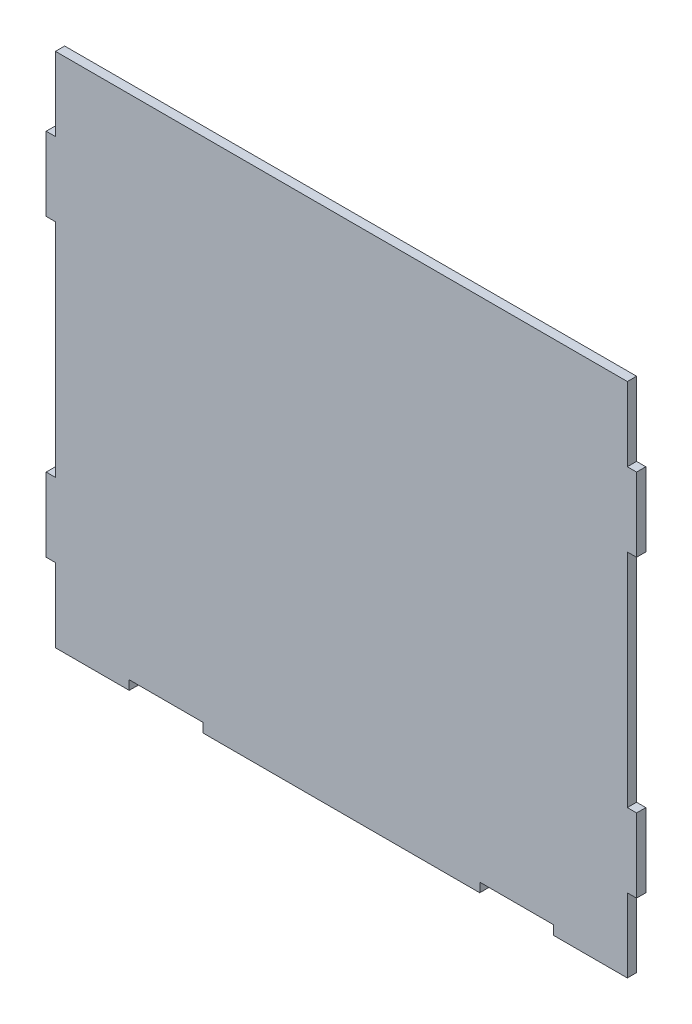
ISO-10303-21;
HEADER;
FILE_DESCRIPTION(('STEP AP214'),'2;1');
FILE_NAME('part.step','',(''),(''),'','','');
FILE_SCHEMA(('AUTOMOTIVE_DESIGN { 1 0 10303 214 1 1 1 1 }'));
ENDSEC;
DATA;
#1=APPLICATION_CONTEXT('core data for automotive mechanical design processes');
#2=APPLICATION_PROTOCOL_DEFINITION('international standard','automotive_design',2000,#1);
#3=PRODUCT_CONTEXT('',#1,'mechanical');
#4=PRODUCT('Part','Part','',(#3));
#5=PRODUCT_RELATED_PRODUCT_CATEGORY('part','',(#4));
#6=PRODUCT_DEFINITION_FORMATION('','',#4);
#7=PRODUCT_DEFINITION_CONTEXT('part definition',#1,'design');
#8=PRODUCT_DEFINITION('design','',#6,#7);
#9=PRODUCT_DEFINITION_SHAPE('','',#8);
#10=(LENGTH_UNIT() NAMED_UNIT(*) SI_UNIT(.MILLI.,.METRE.));
#11=(NAMED_UNIT(*) PLANE_ANGLE_UNIT() SI_UNIT($,.RADIAN.));
#12=(NAMED_UNIT(*) SI_UNIT($,.STERADIAN.) SOLID_ANGLE_UNIT());
#13=UNCERTAINTY_MEASURE_WITH_UNIT(LENGTH_MEASURE(1.E-05),#10,'distance_accuracy_value','');
#14=(GEOMETRIC_REPRESENTATION_CONTEXT(3) GLOBAL_UNCERTAINTY_ASSIGNED_CONTEXT((#13)) GLOBAL_UNIT_ASSIGNED_CONTEXT((#10,
#11,#12)) REPRESENTATION_CONTEXT('',''));
#15=CARTESIAN_POINT('',(0.,0.,0.));
#16=DIRECTION('',(0.,0.,1.));
#17=DIRECTION('',(1.,0.,0.));
#18=AXIS2_PLACEMENT_3D('',#15,#16,#17);
#19=CARTESIAN_POINT('',(0.,25.4,3.175));
#20=DIRECTION('',(1.,0.,0.));
#21=DIRECTION('',(0.,0.,-1.));
#22=AXIS2_PLACEMENT_3D('',#19,#20,#21);
#23=PLANE('',#22);
#24=DIRECTION('',(0.,-1.,0.));
#25=VECTOR('',#24,1.);
#26=CARTESIAN_POINT('',(0.,25.4,0.));
#27=LINE('',#26,#25);
#28=CARTESIAN_POINT('',(0.,25.4,0.));
#29=VERTEX_POINT('',#28);
#30=CARTESIAN_POINT('',(0.,0.,0.));
#31=VERTEX_POINT('',#30);
#32=EDGE_CURVE('E249',#29,#31,#27,.T.);
#33=ORIENTED_EDGE('',*,*,#32,.T.);
#34=DIRECTION('',(0.,0.,-1.));
#35=VECTOR('',#34,1.);
#36=CARTESIAN_POINT('',(0.,0.,3.175));
#37=LINE('',#36,#35);
#38=CARTESIAN_POINT('',(0.,0.,3.175));
#39=VERTEX_POINT('',#38);
#40=EDGE_CURVE('E11',#39,#31,#37,.T.);
#41=ORIENTED_EDGE('',*,*,#40,.F.);
#42=DIRECTION('',(0.,-1.,0.));
#43=VECTOR('',#42,1.);
#44=CARTESIAN_POINT('',(0.,25.4,3.175));
#45=LINE('',#44,#43);
#46=CARTESIAN_POINT('',(0.,25.4,3.175));
#47=VERTEX_POINT('',#46);
#48=EDGE_CURVE('E303',#47,#39,#45,.T.);
#49=ORIENTED_EDGE('',*,*,#48,.F.);
#50=DIRECTION('',(0.,0.,-1.));
#51=VECTOR('',#50,1.);
#52=CARTESIAN_POINT('',(0.,25.4,3.175));
#53=LINE('',#52,#51);
#54=EDGE_CURVE('E245',#47,#29,#53,.T.);
#55=ORIENTED_EDGE('',*,*,#54,.T.);
#56=EDGE_LOOP('',(#33,#41,#49,#55));
#57=FACE_BOUND('',#56,.T.);
#58=ADVANCED_FACE('F33',(#57),#23,.F.);
#59=CARTESIAN_POINT('',(0.,0.,3.175));
#60=DIRECTION('',(0.,1.,0.));
#61=DIRECTION('',(0.,0.,1.));
#62=AXIS2_PLACEMENT_3D('',#59,#60,#61);
#63=PLANE('',#62);
#64=DIRECTION('',(1.,0.,0.));
#65=VECTOR('',#64,1.);
#66=CARTESIAN_POINT('',(0.,0.,0.));
#67=LINE('',#66,#65);
#68=CARTESIAN_POINT('',(25.4,0.,0.));
#69=VERTEX_POINT('',#68);
#70=EDGE_CURVE('E252',#31,#69,#67,.T.);
#71=ORIENTED_EDGE('',*,*,#70,.T.);
#72=DIRECTION('',(0.,0.,-1.));
#73=VECTOR('',#72,1.);
#74=CARTESIAN_POINT('',(25.4,0.,3.175));
#75=LINE('',#74,#73);
#76=CARTESIAN_POINT('',(25.4,0.,3.175));
#77=VERTEX_POINT('',#76);
#78=EDGE_CURVE('E41',#77,#69,#75,.T.);
#79=ORIENTED_EDGE('',*,*,#78,.F.);
#80=DIRECTION('',(1.,0.,0.));
#81=VECTOR('',#80,1.);
#82=CARTESIAN_POINT('',(0.,0.,3.175));
#83=LINE('',#82,#81);
#84=EDGE_CURVE('E152',#39,#77,#83,.T.);
#85=ORIENTED_EDGE('',*,*,#84,.F.);
#86=ORIENTED_EDGE('',*,*,#40,.T.);
#87=EDGE_LOOP('',(#71,#79,#85,#86));
#88=FACE_BOUND('',#87,.T.);
#89=ADVANCED_FACE('F461',(#88),#63,.F.);
#90=CARTESIAN_POINT('',(25.4,0.,3.175));
#91=DIRECTION('',(-1.,0.,0.));
#92=DIRECTION('',(0.,0.,1.));
#93=AXIS2_PLACEMENT_3D('',#90,#91,#92);
#94=PLANE('',#93);
#95=DIRECTION('',(0.,1.,0.));
#96=VECTOR('',#95,1.);
#97=CARTESIAN_POINT('',(25.4,0.,0.));
#98=LINE('',#97,#96);
#99=CARTESIAN_POINT('',(25.4,3.17500000000001,0.));
#100=VERTEX_POINT('',#99);
#101=EDGE_CURVE('E254',#69,#100,#98,.T.);
#102=ORIENTED_EDGE('',*,*,#101,.T.);
#103=DIRECTION('',(0.,0.,-1.));
#104=VECTOR('',#103,1.);
#105=CARTESIAN_POINT('',(25.4,3.17500000000001,3.175));
#106=LINE('',#105,#104);
#107=CARTESIAN_POINT('',(25.4,3.17500000000001,3.175));
#108=VERTEX_POINT('',#107);
#109=EDGE_CURVE('E370',#108,#100,#106,.T.);
#110=ORIENTED_EDGE('',*,*,#109,.F.);
#111=DIRECTION('',(0.,1.,0.));
#112=VECTOR('',#111,1.);
#113=CARTESIAN_POINT('',(25.4,0.,3.175));
#114=LINE('',#113,#112);
#115=EDGE_CURVE('E378',#77,#108,#114,.T.);
#116=ORIENTED_EDGE('',*,*,#115,.F.);
#117=ORIENTED_EDGE('',*,*,#78,.T.);
#118=EDGE_LOOP('',(#102,#110,#116,#117));
#119=FACE_BOUND('',#118,.T.);
#120=ADVANCED_FACE('F376',(#119),#94,.F.);
#121=CARTESIAN_POINT('',(25.4,3.17500000000001,3.175));
#122=DIRECTION('',(0.,1.,0.));
#123=DIRECTION('',(0.,0.,1.));
#124=AXIS2_PLACEMENT_3D('',#121,#122,#123);
#125=PLANE('',#124);
#126=DIRECTION('',(1.,0.,0.));
#127=VECTOR('',#126,1.);
#128=CARTESIAN_POINT('',(25.4,3.17500000000001,0.));
#129=LINE('',#128,#127);
#130=CARTESIAN_POINT('',(50.8,3.17500000000001,0.));
#131=VERTEX_POINT('',#130);
#132=EDGE_CURVE('E256',#100,#131,#129,.T.);
#133=ORIENTED_EDGE('',*,*,#132,.T.);
#134=DIRECTION('',(0.,0.,-1.));
#135=VECTOR('',#134,1.);
#136=CARTESIAN_POINT('',(50.8,3.17500000000001,3.175));
#137=LINE('',#136,#135);
#138=CARTESIAN_POINT('',(50.8,3.17500000000001,3.175));
#139=VERTEX_POINT('',#138);
#140=EDGE_CURVE('E367',#139,#131,#137,.T.);
#141=ORIENTED_EDGE('',*,*,#140,.F.);
#142=DIRECTION('',(1.,0.,0.));
#143=VECTOR('',#142,1.);
#144=CARTESIAN_POINT('',(25.4,3.17500000000001,3.175));
#145=LINE('',#144,#143);
#146=EDGE_CURVE('E396',#108,#139,#145,.T.);
#147=ORIENTED_EDGE('',*,*,#146,.F.);
#148=ORIENTED_EDGE('',*,*,#109,.T.);
#149=EDGE_LOOP('',(#133,#141,#147,#148));
#150=FACE_BOUND('',#149,.T.);
#151=ADVANCED_FACE('F387',(#150),#125,.F.);
#152=CARTESIAN_POINT('',(50.8,3.17500000000001,3.175));
#153=DIRECTION('',(1.,0.,0.));
#154=DIRECTION('',(0.,0.,-1.));
#155=AXIS2_PLACEMENT_3D('',#152,#153,#154);
#156=PLANE('',#155);
#157=DIRECTION('',(0.,-1.,0.));
#158=VECTOR('',#157,1.);
#159=CARTESIAN_POINT('',(50.8,3.17500000000001,0.));
#160=LINE('',#159,#158);
#161=CARTESIAN_POINT('',(50.8,0.,0.));
#162=VERTEX_POINT('',#161);
#163=EDGE_CURVE('E258',#131,#162,#160,.T.);
#164=ORIENTED_EDGE('',*,*,#163,.T.);
#165=DIRECTION('',(0.,0.,-1.));
#166=VECTOR('',#165,1.);
#167=CARTESIAN_POINT('',(50.8,0.,3.175));
#168=LINE('',#167,#166);
#169=CARTESIAN_POINT('',(50.8,0.,3.175));
#170=VERTEX_POINT('',#169);
#171=EDGE_CURVE('E364',#170,#162,#168,.T.);
#172=ORIENTED_EDGE('',*,*,#171,.F.);
#173=DIRECTION('',(0.,-1.,0.));
#174=VECTOR('',#173,1.);
#175=CARTESIAN_POINT('',(50.8,3.17500000000001,3.175));
#176=LINE('',#175,#174);
#177=EDGE_CURVE('E393',#139,#170,#176,.T.);
#178=ORIENTED_EDGE('',*,*,#177,.F.);
#179=ORIENTED_EDGE('',*,*,#140,.T.);
#180=EDGE_LOOP('',(#164,#172,#178,#179));
#181=FACE_BOUND('',#180,.T.);
#182=ADVANCED_FACE('F391',(#181),#156,.F.);
#183=CARTESIAN_POINT('',(50.8,0.,3.175));
#184=DIRECTION('',(0.,1.,0.));
#185=DIRECTION('',(0.,0.,1.));
#186=AXIS2_PLACEMENT_3D('',#183,#184,#185);
#187=PLANE('',#186);
#188=DIRECTION('',(1.,0.,0.));
#189=VECTOR('',#188,1.);
#190=CARTESIAN_POINT('',(50.8,0.,0.));
#191=LINE('',#190,#189);
#192=CARTESIAN_POINT('',(146.05,0.,0.));
#193=VERTEX_POINT('',#192);
#194=EDGE_CURVE('E260',#162,#193,#191,.T.);
#195=ORIENTED_EDGE('',*,*,#194,.T.);
#196=DIRECTION('',(0.,0.,-1.));
#197=VECTOR('',#196,1.);
#198=CARTESIAN_POINT('',(146.05,0.,3.175));
#199=LINE('',#198,#197);
#200=CARTESIAN_POINT('',(146.05,0.,3.175));
#201=VERTEX_POINT('',#200);
#202=EDGE_CURVE('E361',#201,#193,#199,.T.);
#203=ORIENTED_EDGE('',*,*,#202,.F.);
#204=DIRECTION('',(1.,0.,0.));
#205=VECTOR('',#204,1.);
#206=CARTESIAN_POINT('',(50.8,0.,3.175));
#207=LINE('',#206,#205);
#208=EDGE_CURVE('E395',#170,#201,#207,.T.);
#209=ORIENTED_EDGE('',*,*,#208,.F.);
#210=ORIENTED_EDGE('',*,*,#171,.T.);
#211=EDGE_LOOP('',(#195,#203,#209,#210));
#212=FACE_BOUND('',#211,.T.);
#213=ADVANCED_FACE('F474',(#212),#187,.F.);
#214=CARTESIAN_POINT('',(146.05,0.,3.175));
#215=DIRECTION('',(-1.,0.,0.));
#216=DIRECTION('',(0.,0.,1.));
#217=AXIS2_PLACEMENT_3D('',#214,#215,#216);
#218=PLANE('',#217);
#219=DIRECTION('',(0.,1.,0.));
#220=VECTOR('',#219,1.);
#221=CARTESIAN_POINT('',(146.05,0.,0.));
#222=LINE('',#221,#220);
#223=CARTESIAN_POINT('',(146.05,3.17500000000001,0.));
#224=VERTEX_POINT('',#223);
#225=EDGE_CURVE('E262',#193,#224,#222,.T.);
#226=ORIENTED_EDGE('',*,*,#225,.T.);
#227=DIRECTION('',(0.,0.,-1.));
#228=VECTOR('',#227,1.);
#229=CARTESIAN_POINT('',(146.05,3.17500000000001,3.175));
#230=LINE('',#229,#228);
#231=CARTESIAN_POINT('',(146.05,3.17500000000001,3.175));
#232=VERTEX_POINT('',#231);
#233=EDGE_CURVE('E358',#232,#224,#230,.T.);
#234=ORIENTED_EDGE('',*,*,#233,.F.);
#235=DIRECTION('',(0.,1.,0.));
#236=VECTOR('',#235,1.);
#237=CARTESIAN_POINT('',(146.05,0.,3.175));
#238=LINE('',#237,#236);
#239=EDGE_CURVE('E398',#201,#232,#238,.T.);
#240=ORIENTED_EDGE('',*,*,#239,.F.);
#241=ORIENTED_EDGE('',*,*,#202,.T.);
#242=EDGE_LOOP('',(#226,#234,#240,#241));
#243=FACE_BOUND('',#242,.T.);
#244=ADVANCED_FACE('F477',(#243),#218,.F.);
#245=CARTESIAN_POINT('',(146.05,3.17500000000001,3.175));
#246=DIRECTION('',(0.,1.,0.));
#247=DIRECTION('',(0.,0.,1.));
#248=AXIS2_PLACEMENT_3D('',#245,#246,#247);
#249=PLANE('',#248);
#250=DIRECTION('',(1.,0.,0.));
#251=VECTOR('',#250,1.);
#252=CARTESIAN_POINT('',(146.05,3.17500000000001,0.));
#253=LINE('',#252,#251);
#254=CARTESIAN_POINT('',(171.45,3.17500000000001,0.));
#255=VERTEX_POINT('',#254);
#256=EDGE_CURVE('E264',#224,#255,#253,.T.);
#257=ORIENTED_EDGE('',*,*,#256,.T.);
#258=DIRECTION('',(0.,0.,-1.));
#259=VECTOR('',#258,1.);
#260=CARTESIAN_POINT('',(171.45,3.17500000000001,3.175));
#261=LINE('',#260,#259);
#262=CARTESIAN_POINT('',(171.45,3.17500000000001,3.175));
#263=VERTEX_POINT('',#262);
#264=EDGE_CURVE('E355',#263,#255,#261,.T.);
#265=ORIENTED_EDGE('',*,*,#264,.F.);
#266=DIRECTION('',(1.,0.,0.));
#267=VECTOR('',#266,1.);
#268=CARTESIAN_POINT('',(146.05,3.17500000000001,3.175));
#269=LINE('',#268,#267);
#270=EDGE_CURVE('E404',#232,#263,#269,.T.);
#271=ORIENTED_EDGE('',*,*,#270,.F.);
#272=ORIENTED_EDGE('',*,*,#233,.T.);
#273=EDGE_LOOP('',(#257,#265,#271,#272));
#274=FACE_BOUND('',#273,.T.);
#275=ADVANCED_FACE('F481',(#274),#249,.F.);
#276=CARTESIAN_POINT('',(171.45,3.17500000000001,3.175));
#277=DIRECTION('',(1.,0.,0.));
#278=DIRECTION('',(0.,1.,0.));
#279=AXIS2_PLACEMENT_3D('',#276,#277,#278);
#280=PLANE('',#279);
#281=DIRECTION('',(0.,-1.,0.));
#282=VECTOR('',#281,1.);
#283=CARTESIAN_POINT('',(171.45,3.17500000000001,0.));
#284=LINE('',#283,#282);
#285=CARTESIAN_POINT('',(171.45,0.,0.));
#286=VERTEX_POINT('',#285);
#287=EDGE_CURVE('E266',#255,#286,#284,.T.);
#288=ORIENTED_EDGE('',*,*,#287,.T.);
#289=DIRECTION('',(0.,0.,-1.));
#290=VECTOR('',#289,1.);
#291=CARTESIAN_POINT('',(171.45,0.,3.175));
#292=LINE('',#291,#290);
#293=CARTESIAN_POINT('',(171.45,0.,3.175));
#294=VERTEX_POINT('',#293);
#295=EDGE_CURVE('E352',#294,#286,#292,.T.);
#296=ORIENTED_EDGE('',*,*,#295,.F.);
#297=DIRECTION('',(0.,-1.,0.));
#298=VECTOR('',#297,1.);
#299=CARTESIAN_POINT('',(171.45,3.17500000000001,3.175));
#300=LINE('',#299,#298);
#301=EDGE_CURVE('E406',#263,#294,#300,.T.);
#302=ORIENTED_EDGE('',*,*,#301,.F.);
#303=ORIENTED_EDGE('',*,*,#264,.T.);
#304=EDGE_LOOP('',(#288,#296,#302,#303));
#305=FACE_BOUND('',#304,.T.);
#306=ADVANCED_FACE('F485',(#305),#280,.F.);
#307=CARTESIAN_POINT('',(171.45,0.,3.175));
#308=DIRECTION('',(0.,1.,0.));
#309=DIRECTION('',(0.,0.,1.));
#310=AXIS2_PLACEMENT_3D('',#307,#308,#309);
#311=PLANE('',#310);
#312=DIRECTION('',(1.,0.,0.));
#313=VECTOR('',#312,1.);
#314=CARTESIAN_POINT('',(171.45,0.,0.));
#315=LINE('',#314,#313);
#316=CARTESIAN_POINT('',(196.85,0.,0.));
#317=VERTEX_POINT('',#316);
#318=EDGE_CURVE('E268',#286,#317,#315,.T.);
#319=ORIENTED_EDGE('',*,*,#318,.T.);
#320=DIRECTION('',(0.,0.,-1.));
#321=VECTOR('',#320,1.);
#322=CARTESIAN_POINT('',(196.85,0.,3.175));
#323=LINE('',#322,#321);
#324=CARTESIAN_POINT('',(196.85,0.,3.175));
#325=VERTEX_POINT('',#324);
#326=EDGE_CURVE('E349',#325,#317,#323,.T.);
#327=ORIENTED_EDGE('',*,*,#326,.F.);
#328=DIRECTION('',(1.,0.,0.));
#329=VECTOR('',#328,1.);
#330=CARTESIAN_POINT('',(171.45,0.,3.175));
#331=LINE('',#330,#329);
#332=EDGE_CURVE('E408',#294,#325,#331,.T.);
#333=ORIENTED_EDGE('',*,*,#332,.F.);
#334=ORIENTED_EDGE('',*,*,#295,.T.);
#335=EDGE_LOOP('',(#319,#327,#333,#334));
#336=FACE_BOUND('',#335,.T.);
#337=ADVANCED_FACE('F489',(#336),#311,.F.);
#338=CARTESIAN_POINT('',(196.85,25.4,3.175));
#339=DIRECTION('',(-1.,0.,0.));
#340=DIRECTION('',(0.,-1.,0.));
#341=AXIS2_PLACEMENT_3D('',#338,#339,#340);
#342=PLANE('',#341);
#343=DIRECTION('',(0.,1.,0.));
#344=VECTOR('',#343,1.);
#345=CARTESIAN_POINT('',(196.85,25.4,0.));
#346=LINE('',#345,#344);
#347=CARTESIAN_POINT('',(196.85,25.4,0.));
#348=VERTEX_POINT('',#347);
#349=EDGE_CURVE('E270',#317,#348,#346,.T.);
#350=ORIENTED_EDGE('',*,*,#349,.T.);
#351=DIRECTION('',(0.,0.,-1.));
#352=VECTOR('',#351,1.);
#353=CARTESIAN_POINT('',(196.85,25.4,3.175));
#354=LINE('',#353,#352);
#355=CARTESIAN_POINT('',(196.85,25.4,3.175));
#356=VERTEX_POINT('',#355);
#357=EDGE_CURVE('E346',#356,#348,#354,.T.);
#358=ORIENTED_EDGE('',*,*,#357,.F.);
#359=DIRECTION('',(0.,1.,0.));
#360=VECTOR('',#359,1.);
#361=CARTESIAN_POINT('',(196.85,25.4,3.175));
#362=LINE('',#361,#360);
#363=EDGE_CURVE('E410',#325,#356,#362,.T.);
#364=ORIENTED_EDGE('',*,*,#363,.F.);
#365=ORIENTED_EDGE('',*,*,#326,.T.);
#366=EDGE_LOOP('',(#350,#358,#364,#365));
#367=FACE_BOUND('',#366,.T.);
#368=ADVANCED_FACE('F493',(#367),#342,.F.);
#369=CARTESIAN_POINT('',(200.025,25.4,3.175));
#370=DIRECTION('',(0.,1.,0.));
#371=DIRECTION('',(-1.,0.,0.));
#372=AXIS2_PLACEMENT_3D('',#369,#370,#371);
#373=PLANE('',#372);
#374=DIRECTION('',(1.,0.,0.));
#375=VECTOR('',#374,1.);
#376=CARTESIAN_POINT('',(200.025,25.4,0.));
#377=LINE('',#376,#375);
#378=CARTESIAN_POINT('',(200.025,25.4,0.));
#379=VERTEX_POINT('',#378);
#380=EDGE_CURVE('E272',#348,#379,#377,.T.);
#381=ORIENTED_EDGE('',*,*,#380,.T.);
#382=DIRECTION('',(0.,0.,-1.));
#383=VECTOR('',#382,1.);
#384=CARTESIAN_POINT('',(200.025,25.4,3.175));
#385=LINE('',#384,#383);
#386=CARTESIAN_POINT('',(200.025,25.4,3.175));
#387=VERTEX_POINT('',#386);
#388=EDGE_CURVE('E343',#387,#379,#385,.T.);
#389=ORIENTED_EDGE('',*,*,#388,.F.);
#390=DIRECTION('',(1.,0.,0.));
#391=VECTOR('',#390,1.);
#392=CARTESIAN_POINT('',(200.025,25.4,3.175));
#393=LINE('',#392,#391);
#394=EDGE_CURVE('E412',#356,#387,#393,.T.);
#395=ORIENTED_EDGE('',*,*,#394,.F.);
#396=ORIENTED_EDGE('',*,*,#357,.T.);
#397=EDGE_LOOP('',(#381,#389,#395,#396));
#398=FACE_BOUND('',#397,.T.);
#399=ADVANCED_FACE('F497',(#398),#373,.F.);
#400=CARTESIAN_POINT('',(200.025,50.8,3.175));
#401=DIRECTION('',(-1.,0.,0.));
#402=DIRECTION('',(0.,0.,1.));
#403=AXIS2_PLACEMENT_3D('',#400,#401,#402);
#404=PLANE('',#403);
#405=DIRECTION('',(0.,1.,0.));
#406=VECTOR('',#405,1.);
#407=CARTESIAN_POINT('',(200.025,50.8,0.));
#408=LINE('',#407,#406);
#409=CARTESIAN_POINT('',(200.025,50.8,0.));
#410=VERTEX_POINT('',#409);
#411=EDGE_CURVE('E274',#379,#410,#408,.T.);
#412=ORIENTED_EDGE('',*,*,#411,.T.);
#413=DIRECTION('',(0.,0.,-1.));
#414=VECTOR('',#413,1.);
#415=CARTESIAN_POINT('',(200.025,50.8,3.175));
#416=LINE('',#415,#414);
#417=CARTESIAN_POINT('',(200.025,50.8,3.175));
#418=VERTEX_POINT('',#417);
#419=EDGE_CURVE('E340',#418,#410,#416,.T.);
#420=ORIENTED_EDGE('',*,*,#419,.F.);
#421=DIRECTION('',(0.,1.,0.));
#422=VECTOR('',#421,1.);
#423=CARTESIAN_POINT('',(200.025,50.8,3.175));
#424=LINE('',#423,#422);
#425=EDGE_CURVE('E414',#387,#418,#424,.T.);
#426=ORIENTED_EDGE('',*,*,#425,.F.);
#427=ORIENTED_EDGE('',*,*,#388,.T.);
#428=EDGE_LOOP('',(#412,#420,#426,#427));
#429=FACE_BOUND('',#428,.T.);
#430=ADVANCED_FACE('F501',(#429),#404,.F.);
#431=CARTESIAN_POINT('',(196.85,50.8,3.175));
#432=DIRECTION('',(0.,-1.,0.));
#433=DIRECTION('',(1.,0.,0.));
#434=AXIS2_PLACEMENT_3D('',#431,#432,#433);
#435=PLANE('',#434);
#436=DIRECTION('',(-1.,0.,0.));
#437=VECTOR('',#436,1.);
#438=CARTESIAN_POINT('',(196.85,50.8,0.));
#439=LINE('',#438,#437);
#440=CARTESIAN_POINT('',(196.85,50.8,0.));
#441=VERTEX_POINT('',#440);
#442=EDGE_CURVE('E276',#410,#441,#439,.T.);
#443=ORIENTED_EDGE('',*,*,#442,.T.);
#444=DIRECTION('',(0.,0.,-1.));
#445=VECTOR('',#444,1.);
#446=CARTESIAN_POINT('',(196.85,50.8,3.175));
#447=LINE('',#446,#445);
#448=CARTESIAN_POINT('',(196.85,50.8,3.175));
#449=VERTEX_POINT('',#448);
#450=EDGE_CURVE('E337',#449,#441,#447,.T.);
#451=ORIENTED_EDGE('',*,*,#450,.F.);
#452=DIRECTION('',(-1.,0.,0.));
#453=VECTOR('',#452,1.);
#454=CARTESIAN_POINT('',(196.85,50.8,3.175));
#455=LINE('',#454,#453);
#456=EDGE_CURVE('E416',#418,#449,#455,.T.);
#457=ORIENTED_EDGE('',*,*,#456,.F.);
#458=ORIENTED_EDGE('',*,*,#419,.T.);
#459=EDGE_LOOP('',(#443,#451,#457,#458));
#460=FACE_BOUND('',#459,.T.);
#461=ADVANCED_FACE('F505',(#460),#435,.F.);
#462=CARTESIAN_POINT('',(196.85,127.,3.175));
#463=DIRECTION('',(-1.,0.,0.));
#464=DIRECTION('',(0.,0.,1.));
#465=AXIS2_PLACEMENT_3D('',#462,#463,#464);
#466=PLANE('',#465);
#467=DIRECTION('',(0.,1.,0.));
#468=VECTOR('',#467,1.);
#469=CARTESIAN_POINT('',(196.85,127.,0.));
#470=LINE('',#469,#468);
#471=CARTESIAN_POINT('',(196.85,127.,0.));
#472=VERTEX_POINT('',#471);
#473=EDGE_CURVE('E278',#441,#472,#470,.T.);
#474=ORIENTED_EDGE('',*,*,#473,.T.);
#475=DIRECTION('',(0.,0.,-1.));
#476=VECTOR('',#475,1.);
#477=CARTESIAN_POINT('',(196.85,127.,3.175));
#478=LINE('',#477,#476);
#479=CARTESIAN_POINT('',(196.85,127.,3.175));
#480=VERTEX_POINT('',#479);
#481=EDGE_CURVE('E334',#480,#472,#478,.T.);
#482=ORIENTED_EDGE('',*,*,#481,.F.);
#483=DIRECTION('',(0.,1.,0.));
#484=VECTOR('',#483,1.);
#485=CARTESIAN_POINT('',(196.85,127.,3.175));
#486=LINE('',#485,#484);
#487=EDGE_CURVE('E418',#449,#480,#486,.T.);
#488=ORIENTED_EDGE('',*,*,#487,.F.);
#489=ORIENTED_EDGE('',*,*,#450,.T.);
#490=EDGE_LOOP('',(#474,#482,#488,#489));
#491=FACE_BOUND('',#490,.T.);
#492=ADVANCED_FACE('F509',(#491),#466,.F.);
#493=CARTESIAN_POINT('',(200.025,127.,3.175));
#494=DIRECTION('',(0.,1.,0.));
#495=DIRECTION('',(0.,0.,1.));
#496=AXIS2_PLACEMENT_3D('',#493,#494,#495);
#497=PLANE('',#496);
#498=DIRECTION('',(1.,0.,0.));
#499=VECTOR('',#498,1.);
#500=CARTESIAN_POINT('',(200.025,127.,0.));
#501=LINE('',#500,#499);
#502=CARTESIAN_POINT('',(200.025,127.,0.));
#503=VERTEX_POINT('',#502);
#504=EDGE_CURVE('E280',#472,#503,#501,.T.);
#505=ORIENTED_EDGE('',*,*,#504,.T.);
#506=DIRECTION('',(0.,0.,-1.));
#507=VECTOR('',#506,1.);
#508=CARTESIAN_POINT('',(200.025,127.,3.175));
#509=LINE('',#508,#507);
#510=CARTESIAN_POINT('',(200.025,127.,3.175));
#511=VERTEX_POINT('',#510);
#512=EDGE_CURVE('E331',#511,#503,#509,.T.);
#513=ORIENTED_EDGE('',*,*,#512,.F.);
#514=DIRECTION('',(1.,0.,0.));
#515=VECTOR('',#514,1.);
#516=CARTESIAN_POINT('',(200.025,127.,3.175));
#517=LINE('',#516,#515);
#518=EDGE_CURVE('E420',#480,#511,#517,.T.);
#519=ORIENTED_EDGE('',*,*,#518,.F.);
#520=ORIENTED_EDGE('',*,*,#481,.T.);
#521=EDGE_LOOP('',(#505,#513,#519,#520));
#522=FACE_BOUND('',#521,.T.);
#523=ADVANCED_FACE('F513',(#522),#497,.F.);
#524=CARTESIAN_POINT('',(200.025,152.4,3.175));
#525=DIRECTION('',(-1.,0.,0.));
#526=DIRECTION('',(0.,0.,1.));
#527=AXIS2_PLACEMENT_3D('',#524,#525,#526);
#528=PLANE('',#527);
#529=DIRECTION('',(0.,1.,0.));
#530=VECTOR('',#529,1.);
#531=CARTESIAN_POINT('',(200.025,152.4,0.));
#532=LINE('',#531,#530);
#533=CARTESIAN_POINT('',(200.025,152.4,0.));
#534=VERTEX_POINT('',#533);
#535=EDGE_CURVE('E282',#503,#534,#532,.T.);
#536=ORIENTED_EDGE('',*,*,#535,.T.);
#537=DIRECTION('',(0.,0.,-1.));
#538=VECTOR('',#537,1.);
#539=CARTESIAN_POINT('',(200.025,152.4,3.175));
#540=LINE('',#539,#538);
#541=CARTESIAN_POINT('',(200.025,152.4,3.175));
#542=VERTEX_POINT('',#541);
#543=EDGE_CURVE('E328',#542,#534,#540,.T.);
#544=ORIENTED_EDGE('',*,*,#543,.F.);
#545=DIRECTION('',(0.,1.,0.));
#546=VECTOR('',#545,1.);
#547=CARTESIAN_POINT('',(200.025,152.4,3.175));
#548=LINE('',#547,#546);
#549=EDGE_CURVE('E422',#511,#542,#548,.T.);
#550=ORIENTED_EDGE('',*,*,#549,.F.);
#551=ORIENTED_EDGE('',*,*,#512,.T.);
#552=EDGE_LOOP('',(#536,#544,#550,#551));
#553=FACE_BOUND('',#552,.T.);
#554=ADVANCED_FACE('F517',(#553),#528,.F.);
#555=CARTESIAN_POINT('',(196.85,152.4,3.175));
#556=DIRECTION('',(0.,-1.,0.));
#557=DIRECTION('',(0.,0.,-1.));
#558=AXIS2_PLACEMENT_3D('',#555,#556,#557);
#559=PLANE('',#558);
#560=DIRECTION('',(-1.,0.,0.));
#561=VECTOR('',#560,1.);
#562=CARTESIAN_POINT('',(196.85,152.4,0.));
#563=LINE('',#562,#561);
#564=CARTESIAN_POINT('',(196.85,152.4,0.));
#565=VERTEX_POINT('',#564);
#566=EDGE_CURVE('E284',#534,#565,#563,.T.);
#567=ORIENTED_EDGE('',*,*,#566,.T.);
#568=DIRECTION('',(0.,0.,-1.));
#569=VECTOR('',#568,1.);
#570=CARTESIAN_POINT('',(196.85,152.4,3.175));
#571=LINE('',#570,#569);
#572=CARTESIAN_POINT('',(196.85,152.4,3.175));
#573=VERTEX_POINT('',#572);
#574=EDGE_CURVE('E325',#573,#565,#571,.T.);
#575=ORIENTED_EDGE('',*,*,#574,.F.);
#576=DIRECTION('',(-1.,0.,0.));
#577=VECTOR('',#576,1.);
#578=CARTESIAN_POINT('',(196.85,152.4,3.175));
#579=LINE('',#578,#577);
#580=EDGE_CURVE('E424',#542,#573,#579,.T.);
#581=ORIENTED_EDGE('',*,*,#580,.F.);
#582=ORIENTED_EDGE('',*,*,#543,.T.);
#583=EDGE_LOOP('',(#567,#575,#581,#582));
#584=FACE_BOUND('',#583,.T.);
#585=ADVANCED_FACE('F521',(#584),#559,.F.);
#586=CARTESIAN_POINT('',(196.85,177.8,3.175));
#587=DIRECTION('',(-1.,0.,0.));
#588=DIRECTION('',(0.,0.,1.));
#589=AXIS2_PLACEMENT_3D('',#586,#587,#588);
#590=PLANE('',#589);
#591=DIRECTION('',(0.,1.,0.));
#592=VECTOR('',#591,1.);
#593=CARTESIAN_POINT('',(196.85,177.8,0.));
#594=LINE('',#593,#592);
#595=CARTESIAN_POINT('',(196.85,177.8,0.));
#596=VERTEX_POINT('',#595);
#597=EDGE_CURVE('E286',#565,#596,#594,.T.);
#598=ORIENTED_EDGE('',*,*,#597,.T.);
#599=DIRECTION('',(0.,0.,-1.));
#600=VECTOR('',#599,1.);
#601=CARTESIAN_POINT('',(196.85,177.8,3.175));
#602=LINE('',#601,#600);
#603=CARTESIAN_POINT('',(196.85,177.8,3.175));
#604=VERTEX_POINT('',#603);
#605=EDGE_CURVE('E322',#604,#596,#602,.T.);
#606=ORIENTED_EDGE('',*,*,#605,.F.);
#607=DIRECTION('',(0.,1.,0.));
#608=VECTOR('',#607,1.);
#609=CARTESIAN_POINT('',(196.85,177.8,3.175));
#610=LINE('',#609,#608);
#611=EDGE_CURVE('E426',#573,#604,#610,.T.);
#612=ORIENTED_EDGE('',*,*,#611,.F.);
#613=ORIENTED_EDGE('',*,*,#574,.T.);
#614=EDGE_LOOP('',(#598,#606,#612,#613));
#615=FACE_BOUND('',#614,.T.);
#616=ADVANCED_FACE('F525',(#615),#590,.F.);
#617=CARTESIAN_POINT('',(0.,177.8,3.175));
#618=DIRECTION('',(0.,-1.,0.));
#619=DIRECTION('',(0.,0.,-1.));
#620=AXIS2_PLACEMENT_3D('',#617,#618,#619);
#621=PLANE('',#620);
#622=DIRECTION('',(-1.,0.,0.));
#623=VECTOR('',#622,1.);
#624=CARTESIAN_POINT('',(0.,177.8,0.));
#625=LINE('',#624,#623);
#626=CARTESIAN_POINT('',(0.,177.8,0.));
#627=VERTEX_POINT('',#626);
#628=EDGE_CURVE('E288',#596,#627,#625,.T.);
#629=ORIENTED_EDGE('',*,*,#628,.T.);
#630=DIRECTION('',(0.,0.,-1.));
#631=VECTOR('',#630,1.);
#632=CARTESIAN_POINT('',(0.,177.8,3.175));
#633=LINE('',#632,#631);
#634=CARTESIAN_POINT('',(0.,177.8,3.175));
#635=VERTEX_POINT('',#634);
#636=EDGE_CURVE('E319',#635,#627,#633,.T.);
#637=ORIENTED_EDGE('',*,*,#636,.F.);
#638=DIRECTION('',(-1.,0.,0.));
#639=VECTOR('',#638,1.);
#640=CARTESIAN_POINT('',(0.,177.8,3.175));
#641=LINE('',#640,#639);
#642=EDGE_CURVE('E428',#604,#635,#641,.T.);
#643=ORIENTED_EDGE('',*,*,#642,.F.);
#644=ORIENTED_EDGE('',*,*,#605,.T.);
#645=EDGE_LOOP('',(#629,#637,#643,#644));
#646=FACE_BOUND('',#645,.T.);
#647=ADVANCED_FACE('F529',(#646),#621,.F.);
#648=CARTESIAN_POINT('',(0.,177.8,3.175));
#649=DIRECTION('',(1.,0.,0.));
#650=DIRECTION('',(0.,1.,0.));
#651=AXIS2_PLACEMENT_3D('',#648,#649,#650);
#652=PLANE('',#651);
#653=DIRECTION('',(0.,-1.,0.));
#654=VECTOR('',#653,1.);
#655=CARTESIAN_POINT('',(0.,177.8,0.));
#656=LINE('',#655,#654);
#657=CARTESIAN_POINT('',(0.,152.4,0.));
#658=VERTEX_POINT('',#657);
#659=EDGE_CURVE('E290',#627,#658,#656,.T.);
#660=ORIENTED_EDGE('',*,*,#659,.T.);
#661=DIRECTION('',(0.,0.,-1.));
#662=VECTOR('',#661,1.);
#663=CARTESIAN_POINT('',(0.,152.4,3.175));
#664=LINE('',#663,#662);
#665=CARTESIAN_POINT('',(0.,152.4,3.175));
#666=VERTEX_POINT('',#665);
#667=EDGE_CURVE('E316',#666,#658,#664,.T.);
#668=ORIENTED_EDGE('',*,*,#667,.F.);
#669=DIRECTION('',(0.,-1.,0.));
#670=VECTOR('',#669,1.);
#671=CARTESIAN_POINT('',(0.,177.8,3.175));
#672=LINE('',#671,#670);
#673=EDGE_CURVE('E430',#635,#666,#672,.T.);
#674=ORIENTED_EDGE('',*,*,#673,.F.);
#675=ORIENTED_EDGE('',*,*,#636,.T.);
#676=EDGE_LOOP('',(#660,#668,#674,#675));
#677=FACE_BOUND('',#676,.T.);
#678=ADVANCED_FACE('F533',(#677),#652,.F.);
#679=CARTESIAN_POINT('',(0.,152.4,3.175));
#680=DIRECTION('',(0.,-1.,0.));
#681=DIRECTION('',(0.,0.,-1.));
#682=AXIS2_PLACEMENT_3D('',#679,#680,#681);
#683=PLANE('',#682);
#684=DIRECTION('',(-1.,0.,0.));
#685=VECTOR('',#684,1.);
#686=CARTESIAN_POINT('',(0.,152.4,0.));
#687=LINE('',#686,#685);
#688=CARTESIAN_POINT('',(-3.17499999999998,152.4,0.));
#689=VERTEX_POINT('',#688);
#690=EDGE_CURVE('E292',#658,#689,#687,.T.);
#691=ORIENTED_EDGE('',*,*,#690,.T.);
#692=DIRECTION('',(0.,0.,-1.));
#693=VECTOR('',#692,1.);
#694=CARTESIAN_POINT('',(-3.17499999999998,152.4,3.175));
#695=LINE('',#694,#693);
#696=CARTESIAN_POINT('',(-3.17499999999998,152.4,3.175));
#697=VERTEX_POINT('',#696);
#698=EDGE_CURVE('E313',#697,#689,#695,.T.);
#699=ORIENTED_EDGE('',*,*,#698,.F.);
#700=DIRECTION('',(-1.,0.,0.));
#701=VECTOR('',#700,1.);
#702=CARTESIAN_POINT('',(0.,152.4,3.175));
#703=LINE('',#702,#701);
#704=EDGE_CURVE('E432',#666,#697,#703,.T.);
#705=ORIENTED_EDGE('',*,*,#704,.F.);
#706=ORIENTED_EDGE('',*,*,#667,.T.);
#707=EDGE_LOOP('',(#691,#699,#705,#706));
#708=FACE_BOUND('',#707,.T.);
#709=ADVANCED_FACE('F537',(#708),#683,.F.);
#710=CARTESIAN_POINT('',(-3.17499999999998,152.4,3.175));
#711=DIRECTION('',(1.,0.,0.));
#712=DIRECTION('',(0.,1.,0.));
#713=AXIS2_PLACEMENT_3D('',#710,#711,#712);
#714=PLANE('',#713);
#715=DIRECTION('',(0.,-1.,0.));
#716=VECTOR('',#715,1.);
#717=CARTESIAN_POINT('',(-3.17499999999998,152.4,0.));
#718=LINE('',#717,#716);
#719=CARTESIAN_POINT('',(-3.17499999999998,127.,0.));
#720=VERTEX_POINT('',#719);
#721=EDGE_CURVE('E294',#689,#720,#718,.T.);
#722=ORIENTED_EDGE('',*,*,#721,.T.);
#723=DIRECTION('',(0.,0.,-1.));
#724=VECTOR('',#723,1.);
#725=CARTESIAN_POINT('',(-3.17499999999998,127.,3.175));
#726=LINE('',#725,#724);
#727=CARTESIAN_POINT('',(-3.17499999999998,127.,3.175));
#728=VERTEX_POINT('',#727);
#729=EDGE_CURVE('E310',#728,#720,#726,.T.);
#730=ORIENTED_EDGE('',*,*,#729,.F.);
#731=DIRECTION('',(0.,-1.,0.));
#732=VECTOR('',#731,1.);
#733=CARTESIAN_POINT('',(-3.17499999999998,152.4,3.175));
#734=LINE('',#733,#732);
#735=EDGE_CURVE('E434',#697,#728,#734,.T.);
#736=ORIENTED_EDGE('',*,*,#735,.F.);
#737=ORIENTED_EDGE('',*,*,#698,.T.);
#738=EDGE_LOOP('',(#722,#730,#736,#737));
#739=FACE_BOUND('',#738,.T.);
#740=ADVANCED_FACE('F541',(#739),#714,.F.);
#741=CARTESIAN_POINT('',(-3.17499999999998,127.,3.175));
#742=DIRECTION('',(0.,1.,0.));
#743=DIRECTION('',(0.,0.,1.));
#744=AXIS2_PLACEMENT_3D('',#741,#742,#743);
#745=PLANE('',#744);
#746=DIRECTION('',(1.,0.,0.));
#747=VECTOR('',#746,1.);
#748=CARTESIAN_POINT('',(-3.17499999999998,127.,0.));
#749=LINE('',#748,#747);
#750=CARTESIAN_POINT('',(0.,127.,0.));
#751=VERTEX_POINT('',#750);
#752=EDGE_CURVE('E296',#720,#751,#749,.T.);
#753=ORIENTED_EDGE('',*,*,#752,.T.);
#754=DIRECTION('',(0.,0.,-1.));
#755=VECTOR('',#754,1.);
#756=CARTESIAN_POINT('',(0.,127.,3.175));
#757=LINE('',#756,#755);
#758=CARTESIAN_POINT('',(0.,127.,3.175));
#759=VERTEX_POINT('',#758);
#760=EDGE_CURVE('E307',#759,#751,#757,.T.);
#761=ORIENTED_EDGE('',*,*,#760,.F.);
#762=DIRECTION('',(1.,0.,0.));
#763=VECTOR('',#762,1.);
#764=CARTESIAN_POINT('',(-3.17499999999998,127.,3.175));
#765=LINE('',#764,#763);
#766=EDGE_CURVE('E436',#728,#759,#765,.T.);
#767=ORIENTED_EDGE('',*,*,#766,.F.);
#768=ORIENTED_EDGE('',*,*,#729,.T.);
#769=EDGE_LOOP('',(#753,#761,#767,#768));
#770=FACE_BOUND('',#769,.T.);
#771=ADVANCED_FACE('F442',(#770),#745,.F.);
#772=CARTESIAN_POINT('',(0.,127.,3.175));
#773=DIRECTION('',(1.,0.,0.));
#774=DIRECTION('',(0.,1.,0.));
#775=AXIS2_PLACEMENT_3D('',#772,#773,#774);
#776=PLANE('',#775);
#777=DIRECTION('',(0.,-1.,0.));
#778=VECTOR('',#777,1.);
#779=CARTESIAN_POINT('',(0.,127.,0.));
#780=LINE('',#779,#778);
#781=CARTESIAN_POINT('',(0.,50.8,0.));
#782=VERTEX_POINT('',#781);
#783=EDGE_CURVE('E298',#751,#782,#780,.T.);
#784=ORIENTED_EDGE('',*,*,#783,.T.);
#785=DIRECTION('',(0.,0.,-1.));
#786=VECTOR('',#785,1.);
#787=CARTESIAN_POINT('',(0.,50.8,3.175));
#788=LINE('',#787,#786);
#789=CARTESIAN_POINT('',(0.,50.8,3.175));
#790=VERTEX_POINT('',#789);
#791=EDGE_CURVE('E240',#790,#782,#788,.T.);
#792=ORIENTED_EDGE('',*,*,#791,.F.);
#793=DIRECTION('',(0.,-1.,0.));
#794=VECTOR('',#793,1.);
#795=CARTESIAN_POINT('',(0.,127.,3.175));
#796=LINE('',#795,#794);
#797=EDGE_CURVE('E231',#759,#790,#796,.T.);
#798=ORIENTED_EDGE('',*,*,#797,.F.);
#799=ORIENTED_EDGE('',*,*,#760,.T.);
#800=EDGE_LOOP('',(#784,#792,#798,#799));
#801=FACE_BOUND('',#800,.T.);
#802=ADVANCED_FACE('F446',(#801),#776,.F.);
#803=CARTESIAN_POINT('',(0.,50.8,3.175));
#804=DIRECTION('',(0.,-1.,0.));
#805=DIRECTION('',(1.,0.,0.));
#806=AXIS2_PLACEMENT_3D('',#803,#804,#805);
#807=PLANE('',#806);
#808=DIRECTION('',(-1.,0.,0.));
#809=VECTOR('',#808,1.);
#810=CARTESIAN_POINT('',(0.,50.8,0.));
#811=LINE('',#810,#809);
#812=CARTESIAN_POINT('',(-3.175,50.8,0.));
#813=VERTEX_POINT('',#812);
#814=EDGE_CURVE('E239',#782,#813,#811,.T.);
#815=ORIENTED_EDGE('',*,*,#814,.T.);
#816=DIRECTION('',(0.,0.,-1.));
#817=VECTOR('',#816,1.);
#818=CARTESIAN_POINT('',(-3.175,50.8,3.175));
#819=LINE('',#818,#817);
#820=CARTESIAN_POINT('',(-3.175,50.8,3.175));
#821=VERTEX_POINT('',#820);
#822=EDGE_CURVE('E236',#821,#813,#819,.T.);
#823=ORIENTED_EDGE('',*,*,#822,.F.);
#824=DIRECTION('',(-1.,0.,0.));
#825=VECTOR('',#824,1.);
#826=CARTESIAN_POINT('',(0.,50.8,3.175));
#827=LINE('',#826,#825);
#828=EDGE_CURVE('E225',#790,#821,#827,.T.);
#829=ORIENTED_EDGE('',*,*,#828,.F.);
#830=ORIENTED_EDGE('',*,*,#791,.T.);
#831=EDGE_LOOP('',(#815,#823,#829,#830));
#832=FACE_BOUND('',#831,.T.);
#833=ADVANCED_FACE('F237',(#832),#807,.F.);
#834=CARTESIAN_POINT('',(-3.175,50.8,3.175));
#835=DIRECTION('',(1.,0.,0.));
#836=DIRECTION('',(0.,1.,0.));
#837=AXIS2_PLACEMENT_3D('',#834,#835,#836);
#838=PLANE('',#837);
#839=DIRECTION('',(0.,-1.,0.));
#840=VECTOR('',#839,1.);
#841=CARTESIAN_POINT('',(-3.175,50.8,0.));
#842=LINE('',#841,#840);
#843=CARTESIAN_POINT('',(-3.175,25.4,0.));
#844=VERTEX_POINT('',#843);
#845=EDGE_CURVE('E138',#813,#844,#842,.T.);
#846=ORIENTED_EDGE('',*,*,#845,.T.);
#847=DIRECTION('',(0.,0.,-1.));
#848=VECTOR('',#847,1.);
#849=CARTESIAN_POINT('',(-3.175,25.4,3.175));
#850=LINE('',#849,#848);
#851=CARTESIAN_POINT('',(-3.175,25.4,3.175));
#852=VERTEX_POINT('',#851);
#853=EDGE_CURVE('E241',#852,#844,#850,.T.);
#854=ORIENTED_EDGE('',*,*,#853,.F.);
#855=DIRECTION('',(0.,-1.,0.));
#856=VECTOR('',#855,1.);
#857=CARTESIAN_POINT('',(-3.175,50.8,3.175));
#858=LINE('',#857,#856);
#859=EDGE_CURVE('E229',#821,#852,#858,.T.);
#860=ORIENTED_EDGE('',*,*,#859,.F.);
#861=ORIENTED_EDGE('',*,*,#822,.T.);
#862=EDGE_LOOP('',(#846,#854,#860,#861));
#863=FACE_BOUND('',#862,.T.);
#864=ADVANCED_FACE('F243',(#863),#838,.F.);
#865=CARTESIAN_POINT('',(-3.175,25.4,3.175));
#866=DIRECTION('',(0.,1.,0.));
#867=DIRECTION('',(0.,0.,1.));
#868=AXIS2_PLACEMENT_3D('',#865,#866,#867);
#869=PLANE('',#868);
#870=DIRECTION('',(1.,0.,0.));
#871=VECTOR('',#870,1.);
#872=CARTESIAN_POINT('',(-3.175,25.4,0.));
#873=LINE('',#872,#871);
#874=EDGE_CURVE('E144',#844,#29,#873,.T.);
#875=ORIENTED_EDGE('',*,*,#874,.T.);
#876=ORIENTED_EDGE('',*,*,#54,.F.);
#877=DIRECTION('',(1.,0.,0.));
#878=VECTOR('',#877,1.);
#879=CARTESIAN_POINT('',(-3.175,25.4,3.175));
#880=LINE('',#879,#878);
#881=EDGE_CURVE('E49',#852,#47,#880,.T.);
#882=ORIENTED_EDGE('',*,*,#881,.F.);
#883=ORIENTED_EDGE('',*,*,#853,.T.);
#884=EDGE_LOOP('',(#875,#876,#882,#883));
#885=FACE_BOUND('',#884,.T.);
#886=ADVANCED_FACE('F450',(#885),#869,.F.);
#887=CARTESIAN_POINT('',(0.,0.,3.175));
#888=DIRECTION('',(0.,0.,1.));
#889=DIRECTION('',(1.,0.,0.));
#890=AXIS2_PLACEMENT_3D('',#887,#888,#889);
#891=PLANE('',#890);
#892=ORIENTED_EDGE('',*,*,#48,.T.);
#893=ORIENTED_EDGE('',*,*,#84,.T.);
#894=ORIENTED_EDGE('',*,*,#115,.T.);
#895=ORIENTED_EDGE('',*,*,#146,.T.);
#896=ORIENTED_EDGE('',*,*,#177,.T.);
#897=ORIENTED_EDGE('',*,*,#208,.T.);
#898=ORIENTED_EDGE('',*,*,#239,.T.);
#899=ORIENTED_EDGE('',*,*,#270,.T.);
#900=ORIENTED_EDGE('',*,*,#301,.T.);
#901=ORIENTED_EDGE('',*,*,#332,.T.);
#902=ORIENTED_EDGE('',*,*,#363,.T.);
#903=ORIENTED_EDGE('',*,*,#394,.T.);
#904=ORIENTED_EDGE('',*,*,#425,.T.);
#905=ORIENTED_EDGE('',*,*,#456,.T.);
#906=ORIENTED_EDGE('',*,*,#487,.T.);
#907=ORIENTED_EDGE('',*,*,#518,.T.);
#908=ORIENTED_EDGE('',*,*,#549,.T.);
#909=ORIENTED_EDGE('',*,*,#580,.T.);
#910=ORIENTED_EDGE('',*,*,#611,.T.);
#911=ORIENTED_EDGE('',*,*,#642,.T.);
#912=ORIENTED_EDGE('',*,*,#673,.T.);
#913=ORIENTED_EDGE('',*,*,#704,.T.);
#914=ORIENTED_EDGE('',*,*,#735,.T.);
#915=ORIENTED_EDGE('',*,*,#766,.T.);
#916=ORIENTED_EDGE('',*,*,#797,.T.);
#917=ORIENTED_EDGE('',*,*,#828,.T.);
#918=ORIENTED_EDGE('',*,*,#859,.T.);
#919=ORIENTED_EDGE('',*,*,#881,.T.);
#920=EDGE_LOOP('',(#892,#893,#894,#895,#896,#897,#898,#899,#900,#901,#902,#903,#904,#905,#906,
#907,#908,#909,#910,#911,#912,#913,#914,#915,#916,#917,#918,#919));
#921=FACE_BOUND('',#920,.T.);
#922=ADVANCED_FACE('F227',(#921),#891,.T.);
#923=CARTESIAN_POINT('',(0.,0.,0.));
#924=DIRECTION('',(0.,0.,1.));
#925=DIRECTION('',(1.,0.,0.));
#926=AXIS2_PLACEMENT_3D('',#923,#924,#925);
#927=PLANE('',#926);
#928=ORIENTED_EDGE('',*,*,#32,.F.);
#929=ORIENTED_EDGE('',*,*,#874,.F.);
#930=ORIENTED_EDGE('',*,*,#845,.F.);
#931=ORIENTED_EDGE('',*,*,#814,.F.);
#932=ORIENTED_EDGE('',*,*,#783,.F.);
#933=ORIENTED_EDGE('',*,*,#752,.F.);
#934=ORIENTED_EDGE('',*,*,#721,.F.);
#935=ORIENTED_EDGE('',*,*,#690,.F.);
#936=ORIENTED_EDGE('',*,*,#659,.F.);
#937=ORIENTED_EDGE('',*,*,#628,.F.);
#938=ORIENTED_EDGE('',*,*,#597,.F.);
#939=ORIENTED_EDGE('',*,*,#566,.F.);
#940=ORIENTED_EDGE('',*,*,#535,.F.);
#941=ORIENTED_EDGE('',*,*,#504,.F.);
#942=ORIENTED_EDGE('',*,*,#473,.F.);
#943=ORIENTED_EDGE('',*,*,#442,.F.);
#944=ORIENTED_EDGE('',*,*,#411,.F.);
#945=ORIENTED_EDGE('',*,*,#380,.F.);
#946=ORIENTED_EDGE('',*,*,#349,.F.);
#947=ORIENTED_EDGE('',*,*,#318,.F.);
#948=ORIENTED_EDGE('',*,*,#287,.F.);
#949=ORIENTED_EDGE('',*,*,#256,.F.);
#950=ORIENTED_EDGE('',*,*,#225,.F.);
#951=ORIENTED_EDGE('',*,*,#194,.F.);
#952=ORIENTED_EDGE('',*,*,#163,.F.);
#953=ORIENTED_EDGE('',*,*,#132,.F.);
#954=ORIENTED_EDGE('',*,*,#101,.F.);
#955=ORIENTED_EDGE('',*,*,#70,.F.);
#956=EDGE_LOOP('',(#928,#929,#930,#931,#932,#933,#934,#935,#936,#937,#938,#939,#940,#941,#942,
#943,#944,#945,#946,#947,#948,#949,#950,#951,#952,#953,#954,#955));
#957=FACE_BOUND('',#956,.T.);
#958=ADVANCED_FACE('F382',(#957),#927,.F.);
#959=CLOSED_SHELL('',(#58,#89,#120,#151,#182,#213,#244,#275,#306,#337,#368,#399,#430,#461,#492,
#523,#554,#585,#616,#647,#678,#709,#740,#771,#802,#833,#864,#886,#922,#958));
#960=MANIFOLD_SOLID_BREP('B2',#959);
#961=ADVANCED_BREP_SHAPE_REPRESENTATION('',(#18,#960),#14);
#962=SHAPE_DEFINITION_REPRESENTATION(#9,#961);
ENDSEC;
END-ISO-10303-21;
